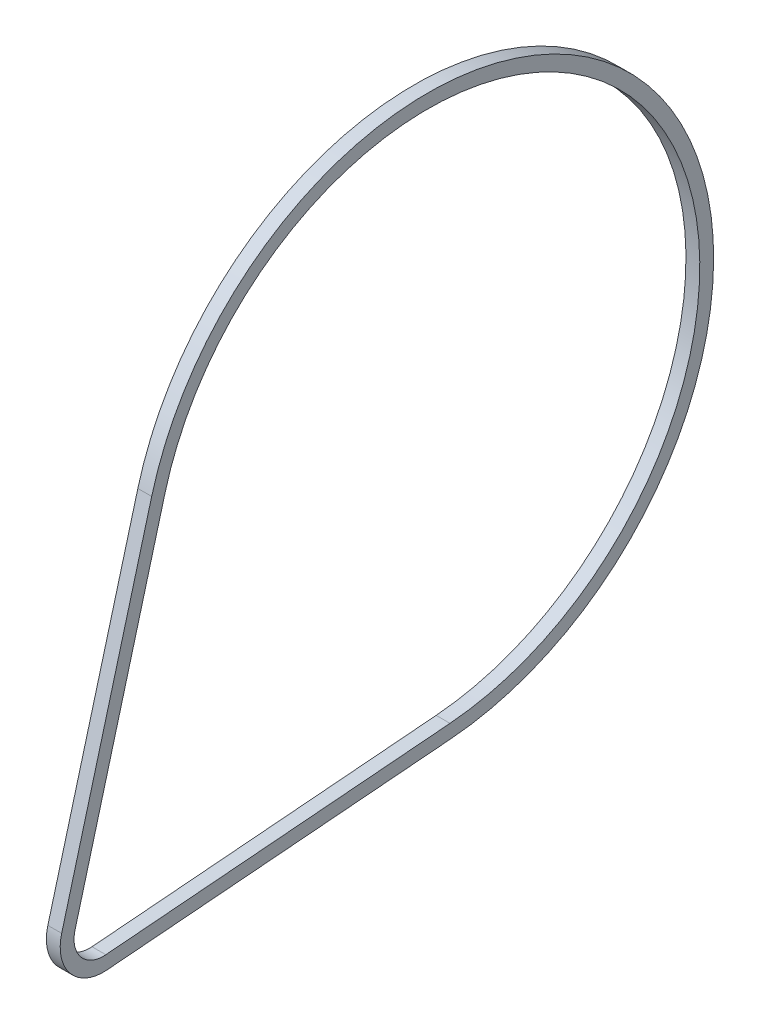
ISO-10303-21;
HEADER;
FILE_DESCRIPTION(('STEP AP214'),'2;1');
FILE_NAME('part.step','',(''),(''),'','','');
FILE_SCHEMA(('AUTOMOTIVE_DESIGN { 1 0 10303 214 1 1 1 1 }'));
ENDSEC;
DATA;
#1=APPLICATION_CONTEXT('core data for automotive mechanical design processes');
#2=APPLICATION_PROTOCOL_DEFINITION('international standard','automotive_design',2000,#1);
#3=PRODUCT_CONTEXT('',#1,'mechanical');
#4=PRODUCT('Part','Part','',(#3));
#5=PRODUCT_RELATED_PRODUCT_CATEGORY('part','',(#4));
#6=PRODUCT_DEFINITION_FORMATION('','',#4);
#7=PRODUCT_DEFINITION_CONTEXT('part definition',#1,'design');
#8=PRODUCT_DEFINITION('design','',#6,#7);
#9=PRODUCT_DEFINITION_SHAPE('','',#8);
#10=(LENGTH_UNIT() NAMED_UNIT(*) SI_UNIT(.MILLI.,.METRE.));
#11=(NAMED_UNIT(*) PLANE_ANGLE_UNIT() SI_UNIT($,.RADIAN.));
#12=(NAMED_UNIT(*) SI_UNIT($,.STERADIAN.) SOLID_ANGLE_UNIT());
#13=UNCERTAINTY_MEASURE_WITH_UNIT(LENGTH_MEASURE(1.E-05),#10,'distance_accuracy_value','');
#14=(GEOMETRIC_REPRESENTATION_CONTEXT(3) GLOBAL_UNCERTAINTY_ASSIGNED_CONTEXT((#13)) GLOBAL_UNIT_ASSIGNED_CONTEXT((#10,
#11,#12)) REPRESENTATION_CONTEXT('',''));
#15=CARTESIAN_POINT('',(0.,0.,0.));
#16=DIRECTION('',(0.,0.,1.));
#17=DIRECTION('',(1.,0.,0.));
#18=AXIS2_PLACEMENT_3D('',#15,#16,#17);
#19=CARTESIAN_POINT('',(5.08,139.776064008969,-221.959303487883));
#20=DIRECTION('',(1.,0.,0.));
#21=DIRECTION('',(0.,0.,-1.));
#22=AXIS2_PLACEMENT_3D('',#19,#20,#21);
#23=PLANE('',#22);
#24=CARTESIAN_POINT('',(5.08,139.776064008969,-221.959303487883));
#25=DIRECTION('',(1.,0.,0.));
#26=DIRECTION('',(0.,0.,-1.));
#27=AXIS2_PLACEMENT_3D('',#24,#25,#26);
#28=CIRCLE('',#27,105.);
#29=CARTESIAN_POINT('',(5.08,35.1288531643463,-230.559376885311));
#30=VERTEX_POINT('',#29);
#31=CARTESIAN_POINT('',(5.08,167.137640487071,-120.586998923802));
#32=VERTEX_POINT('',#31);
#33=EDGE_CURVE('E149',#30,#32,#28,.T.);
#34=ORIENTED_EDGE('',*,*,#33,.T.);
#35=DIRECTION('',(0.,-0.965450519657921,0.260586442648596));
#36=VECTOR('',#35,1.);
#37=CARTESIAN_POINT('',(5.08,167.137640487071,-120.586998923802));
#38=LINE('',#37,#36);
#39=CARTESIAN_POINT('',(5.08,44.700154531778,-87.5396823992513));
#40=VERTEX_POINT('',#39);
#41=EDGE_CURVE('E152',#32,#40,#38,.T.);
#42=ORIENTED_EDGE('',*,*,#41,.T.);
#43=CARTESIAN_POINT('',(5.08,40.5633447546829,-102.866209399001));
#44=DIRECTION('',(1.,0.,0.));
#45=DIRECTION('',(0.,0.,-1.));
#46=AXIS2_PLACEMENT_3D('',#43,#44,#45);
#47=CIRCLE('',#46,15.8750000001865);
#48=CARTESIAN_POINT('',(5.08,24.7416831148934,-104.166458591246));
#49=VERTEX_POINT('',#48);
#50=EDGE_CURVE('E155',#40,#49,#47,.T.);
#51=ORIENTED_EDGE('',*,*,#50,.T.);
#52=DIRECTION('',(0.,0.0819054609278826,-0.996640103282118));
#53=VECTOR('',#52,1.);
#54=CARTESIAN_POINT('',(5.08,24.7416831148934,-104.166458591246));
#55=LINE('',#54,#53);
#56=EDGE_CURVE('E157',#49,#30,#55,.T.);
#57=ORIENTED_EDGE('',*,*,#56,.T.);
#58=EDGE_LOOP('',(#34,#42,#51,#57));
#59=FACE_BOUND('',#58,.T.);
#60=DIRECTION('',(0.,0.0819054609278947,-0.996640103282117));
#61=VECTOR('',#60,1.);
#62=CARTESIAN_POINT('',(5.08,29.8046148395667,-103.750378849733));
#63=LINE('',#62,#61);
#64=CARTESIAN_POINT('',(5.08,29.8046148395667,-103.750378849733));
#65=VERTEX_POINT('',#64);
#66=CARTESIAN_POINT('',(5.08,40.1917848890211,-230.143297143798));
#67=VERTEX_POINT('',#66);
#68=EDGE_CURVE('E121',#65,#67,#63,.T.);
#69=ORIENTED_EDGE('',*,*,#68,.F.);
#70=CARTESIAN_POINT('',(5.08,40.5633447546829,-102.866209399001));
#71=DIRECTION('',(1.,0.,0.));
#72=DIRECTION('',(0.,0.,-1.));
#73=AXIS2_PLACEMENT_3D('',#70,#71,#72);
#74=CIRCLE('',#73,10.7950000001864);
#75=CARTESIAN_POINT('',(5.08,43.3763754031231,-92.4441710391137));
#76=VERTEX_POINT('',#75);
#77=EDGE_CURVE('E113',#76,#65,#74,.T.);
#78=ORIENTED_EDGE('',*,*,#77,.F.);
#79=DIRECTION('',(0.,-0.965450519657921,0.260586442648596));
#80=VECTOR('',#79,1.);
#81=CARTESIAN_POINT('',(5.08,165.813861358417,-125.491487563664));
#82=LINE('',#81,#80);
#83=CARTESIAN_POINT('',(5.08,165.813861358417,-125.491487563665));
#84=VERTEX_POINT('',#83);
#85=EDGE_CURVE('E135',#84,#76,#82,.T.);
#86=ORIENTED_EDGE('',*,*,#85,.F.);
#87=CARTESIAN_POINT('',(5.08,139.776064008969,-221.959303487883));
#88=DIRECTION('',(1.,0.,0.));
#89=DIRECTION('',(0.,0.,-1.));
#90=AXIS2_PLACEMENT_3D('',#87,#88,#89);
#91=CIRCLE('',#90,99.919999999999);
#92=EDGE_CURVE('E133',#67,#84,#91,.T.);
#93=ORIENTED_EDGE('',*,*,#92,.F.);
#94=EDGE_LOOP('',(#69,#78,#86,#93));
#95=FACE_BOUND('',#94,.T.);
#96=ADVANCED_FACE('F48',(#59,#95),#23,.T.);
#97=CARTESIAN_POINT('',(0.,139.776064008969,-221.959303487883));
#98=DIRECTION('',(1.,0.,0.));
#99=DIRECTION('',(0.,0.,-1.));
#100=AXIS2_PLACEMENT_3D('',#97,#98,#99);
#101=PLANE('',#100);
#102=CARTESIAN_POINT('',(0.,139.776064008969,-221.959303487883));
#103=DIRECTION('',(1.,0.,0.));
#104=DIRECTION('',(0.,0.,-1.));
#105=AXIS2_PLACEMENT_3D('',#102,#103,#104);
#106=CIRCLE('',#105,105.);
#107=CARTESIAN_POINT('',(0.,35.1288531643463,-230.559376885311));
#108=VERTEX_POINT('',#107);
#109=CARTESIAN_POINT('',(0.,167.137640487071,-120.586998923802));
#110=VERTEX_POINT('',#109);
#111=EDGE_CURVE('E129',#108,#110,#106,.T.);
#112=ORIENTED_EDGE('',*,*,#111,.F.);
#113=DIRECTION('',(0.,0.0819054609278826,-0.996640103282118));
#114=VECTOR('',#113,1.);
#115=CARTESIAN_POINT('',(0.,24.7416831148934,-104.166458591246));
#116=LINE('',#115,#114);
#117=CARTESIAN_POINT('',(0.,24.7416831148934,-104.166458591246));
#118=VERTEX_POINT('',#117);
#119=EDGE_CURVE('E153',#118,#108,#116,.T.);
#120=ORIENTED_EDGE('',*,*,#119,.F.);
#121=CARTESIAN_POINT('',(0.,40.5633447546829,-102.866209399001));
#122=DIRECTION('',(1.,0.,0.));
#123=DIRECTION('',(0.,0.,-1.));
#124=AXIS2_PLACEMENT_3D('',#121,#122,#123);
#125=CIRCLE('',#124,15.8750000001865);
#126=CARTESIAN_POINT('',(0.,44.700154531778,-87.5396823992513));
#127=VERTEX_POINT('',#126);
#128=EDGE_CURVE('E164',#127,#118,#125,.T.);
#129=ORIENTED_EDGE('',*,*,#128,.F.);
#130=DIRECTION('',(0.,-0.965450519657921,0.260586442648596));
#131=VECTOR('',#130,1.);
#132=CARTESIAN_POINT('',(0.,167.137640487071,-120.586998923802));
#133=LINE('',#132,#131);
#134=EDGE_CURVE('E162',#110,#127,#133,.T.);
#135=ORIENTED_EDGE('',*,*,#134,.F.);
#136=EDGE_LOOP('',(#112,#120,#129,#135));
#137=FACE_BOUND('',#136,.T.);
#138=CARTESIAN_POINT('',(0.,40.5633447546829,-102.866209399001));
#139=DIRECTION('',(1.,0.,0.));
#140=DIRECTION('',(0.,0.,-1.));
#141=AXIS2_PLACEMENT_3D('',#138,#139,#140);
#142=CIRCLE('',#141,10.7950000001864);
#143=CARTESIAN_POINT('',(0.,43.3763754031231,-92.4441710391137));
#144=VERTEX_POINT('',#143);
#145=CARTESIAN_POINT('',(0.,29.8046148395667,-103.750378849733));
#146=VERTEX_POINT('',#145);
#147=EDGE_CURVE('E71',#144,#146,#142,.T.);
#148=ORIENTED_EDGE('',*,*,#147,.T.);
#149=DIRECTION('',(0.,0.0819054609278947,-0.996640103282117));
#150=VECTOR('',#149,1.);
#151=CARTESIAN_POINT('',(0.,29.8046148395667,-103.750378849733));
#152=LINE('',#151,#150);
#153=CARTESIAN_POINT('',(0.,40.1917848890211,-230.143297143798));
#154=VERTEX_POINT('',#153);
#155=EDGE_CURVE('E128',#146,#154,#152,.T.);
#156=ORIENTED_EDGE('',*,*,#155,.T.);
#157=CARTESIAN_POINT('',(0.,139.776064008969,-221.959303487883));
#158=DIRECTION('',(1.,0.,0.));
#159=DIRECTION('',(0.,0.,-1.));
#160=AXIS2_PLACEMENT_3D('',#157,#158,#159);
#161=CIRCLE('',#160,99.919999999999);
#162=CARTESIAN_POINT('',(0.,165.813861358417,-125.491487563665));
#163=VERTEX_POINT('',#162);
#164=EDGE_CURVE('E141',#154,#163,#161,.T.);
#165=ORIENTED_EDGE('',*,*,#164,.T.);
#166=DIRECTION('',(0.,-0.965450519657921,0.260586442648596));
#167=VECTOR('',#166,1.);
#168=CARTESIAN_POINT('',(0.,165.813861358417,-125.491487563664));
#169=LINE('',#168,#167);
#170=EDGE_CURVE('E122',#163,#144,#169,.T.);
#171=ORIENTED_EDGE('',*,*,#170,.T.);
#172=EDGE_LOOP('',(#148,#156,#165,#171));
#173=FACE_BOUND('',#172,.T.);
#174=ADVANCED_FACE('F182',(#137,#173),#101,.F.);
#175=CARTESIAN_POINT('',(5.08,139.776064008969,-221.959303487883));
#176=DIRECTION('',(-1.,0.,0.));
#177=DIRECTION('',(0.,0.,1.));
#178=AXIS2_PLACEMENT_3D('',#175,#176,#177);
#179=CYLINDRICAL_SURFACE('',#178,105.);
#180=ORIENTED_EDGE('',*,*,#111,.T.);
#181=DIRECTION('',(-1.,0.,0.));
#182=VECTOR('',#181,1.);
#183=CARTESIAN_POINT('',(5.08,167.137640487071,-120.586998923802));
#184=LINE('',#183,#182);
#185=EDGE_CURVE('E13',#32,#110,#184,.T.);
#186=ORIENTED_EDGE('',*,*,#185,.F.);
#187=ORIENTED_EDGE('',*,*,#33,.F.);
#188=DIRECTION('',(-1.,0.,0.));
#189=VECTOR('',#188,1.);
#190=CARTESIAN_POINT('',(5.08,35.1288531643463,-230.559376885311));
#191=LINE('',#190,#189);
#192=EDGE_CURVE('E159',#30,#108,#191,.T.);
#193=ORIENTED_EDGE('',*,*,#192,.T.);
#194=EDGE_LOOP('',(#180,#186,#187,#193));
#195=FACE_BOUND('',#194,.T.);
#196=ADVANCED_FACE('F50',(#195),#179,.T.);
#197=CARTESIAN_POINT('',(5.08,167.137640487071,-120.586998923802));
#198=DIRECTION('',(0.,-0.260586442648596,-0.965450519657921));
#199=DIRECTION('',(0.,0.965450519657921,-0.260586442648596));
#200=AXIS2_PLACEMENT_3D('',#197,#198,#199);
#201=PLANE('',#200);
#202=ORIENTED_EDGE('',*,*,#134,.T.);
#203=DIRECTION('',(-1.,0.,0.));
#204=VECTOR('',#203,1.);
#205=CARTESIAN_POINT('',(5.08,44.700154531778,-87.5396823992513));
#206=LINE('',#205,#204);
#207=EDGE_CURVE('E56',#40,#127,#206,.T.);
#208=ORIENTED_EDGE('',*,*,#207,.F.);
#209=ORIENTED_EDGE('',*,*,#41,.F.);
#210=ORIENTED_EDGE('',*,*,#185,.T.);
#211=EDGE_LOOP('',(#202,#208,#209,#210));
#212=FACE_BOUND('',#211,.T.);
#213=ADVANCED_FACE('F192',(#212),#201,.F.);
#214=CARTESIAN_POINT('',(5.08,40.5633447546829,-102.866209399001));
#215=DIRECTION('',(-1.,0.,0.));
#216=DIRECTION('',(0.,0.,1.));
#217=AXIS2_PLACEMENT_3D('',#214,#215,#216);
#218=CYLINDRICAL_SURFACE('',#217,15.8750000001865);
#219=ORIENTED_EDGE('',*,*,#128,.T.);
#220=DIRECTION('',(-1.,0.,0.));
#221=VECTOR('',#220,1.);
#222=CARTESIAN_POINT('',(5.08,24.7416831148934,-104.166458591246));
#223=LINE('',#222,#221);
#224=EDGE_CURVE('E169',#49,#118,#223,.T.);
#225=ORIENTED_EDGE('',*,*,#224,.F.);
#226=ORIENTED_EDGE('',*,*,#50,.F.);
#227=ORIENTED_EDGE('',*,*,#207,.T.);
#228=EDGE_LOOP('',(#219,#225,#226,#227));
#229=FACE_BOUND('',#228,.T.);
#230=ADVANCED_FACE('F176',(#229),#218,.T.);
#231=CARTESIAN_POINT('',(5.08,24.7416831148934,-104.166458591246));
#232=DIRECTION('',(0.,0.996640103282118,0.0819054609278826));
#233=DIRECTION('',(0.,-0.0819054609278826,0.996640103282118));
#234=AXIS2_PLACEMENT_3D('',#231,#232,#233);
#235=PLANE('',#234);
#236=ORIENTED_EDGE('',*,*,#119,.T.);
#237=ORIENTED_EDGE('',*,*,#192,.F.);
#238=ORIENTED_EDGE('',*,*,#56,.F.);
#239=ORIENTED_EDGE('',*,*,#224,.T.);
#240=EDGE_LOOP('',(#236,#237,#238,#239));
#241=FACE_BOUND('',#240,.T.);
#242=ADVANCED_FACE('F186',(#241),#235,.F.);
#243=CARTESIAN_POINT('',(5.08,40.5633447546829,-102.866209399001));
#244=DIRECTION('',(-1.,0.,0.));
#245=DIRECTION('',(0.,0.,1.));
#246=AXIS2_PLACEMENT_3D('',#243,#244,#245);
#247=CYLINDRICAL_SURFACE('',#246,10.7950000001864);
#248=ORIENTED_EDGE('',*,*,#147,.F.);
#249=DIRECTION('',(-1.,0.,0.));
#250=VECTOR('',#249,1.);
#251=CARTESIAN_POINT('',(5.08,43.3763754031231,-92.4441710391137));
#252=LINE('',#251,#250);
#253=EDGE_CURVE('E117',#76,#144,#252,.T.);
#254=ORIENTED_EDGE('',*,*,#253,.F.);
#255=ORIENTED_EDGE('',*,*,#77,.T.);
#256=DIRECTION('',(-1.,0.,0.));
#257=VECTOR('',#256,1.);
#258=CARTESIAN_POINT('',(5.08,29.8046148395667,-103.750378849733));
#259=LINE('',#258,#257);
#260=EDGE_CURVE('E116',#65,#146,#259,.T.);
#261=ORIENTED_EDGE('',*,*,#260,.T.);
#262=EDGE_LOOP('',(#248,#254,#255,#261));
#263=FACE_BOUND('',#262,.T.);
#264=ADVANCED_FACE('F115',(#263),#247,.F.);
#265=CARTESIAN_POINT('',(5.08,29.8046148395667,-103.750378849733));
#266=DIRECTION('',(0.,0.996640103282117,0.0819054609278947));
#267=DIRECTION('',(0.,-0.0819054609278947,0.996640103282117));
#268=AXIS2_PLACEMENT_3D('',#265,#266,#267);
#269=PLANE('',#268);
#270=ORIENTED_EDGE('',*,*,#155,.F.);
#271=ORIENTED_EDGE('',*,*,#260,.F.);
#272=ORIENTED_EDGE('',*,*,#68,.T.);
#273=DIRECTION('',(-1.,0.,0.));
#274=VECTOR('',#273,1.);
#275=CARTESIAN_POINT('',(5.08,40.1917848890211,-230.143297143798));
#276=LINE('',#275,#274);
#277=EDGE_CURVE('E130',#67,#154,#276,.T.);
#278=ORIENTED_EDGE('',*,*,#277,.T.);
#279=EDGE_LOOP('',(#270,#271,#272,#278));
#280=FACE_BOUND('',#279,.T.);
#281=ADVANCED_FACE('F125',(#280),#269,.T.);
#282=CARTESIAN_POINT('',(5.08,139.776064008969,-221.959303487883));
#283=DIRECTION('',(-1.,0.,0.));
#284=DIRECTION('',(0.,0.,1.));
#285=AXIS2_PLACEMENT_3D('',#282,#283,#284);
#286=CYLINDRICAL_SURFACE('',#285,99.919999999999);
#287=ORIENTED_EDGE('',*,*,#164,.F.);
#288=ORIENTED_EDGE('',*,*,#277,.F.);
#289=ORIENTED_EDGE('',*,*,#92,.T.);
#290=DIRECTION('',(-1.,0.,0.));
#291=VECTOR('',#290,1.);
#292=CARTESIAN_POINT('',(5.08,165.813861358417,-125.491487563665));
#293=LINE('',#292,#291);
#294=EDGE_CURVE('E63',#84,#163,#293,.T.);
#295=ORIENTED_EDGE('',*,*,#294,.T.);
#296=EDGE_LOOP('',(#287,#288,#289,#295));
#297=FACE_BOUND('',#296,.T.);
#298=ADVANCED_FACE('F215',(#297),#286,.F.);
#299=CARTESIAN_POINT('',(5.08,165.813861358417,-125.491487563664));
#300=DIRECTION('',(0.,-0.260586442648596,-0.965450519657921));
#301=DIRECTION('',(0.,0.965450519657921,-0.260586442648596));
#302=AXIS2_PLACEMENT_3D('',#299,#300,#301);
#303=PLANE('',#302);
#304=ORIENTED_EDGE('',*,*,#170,.F.);
#305=ORIENTED_EDGE('',*,*,#294,.F.);
#306=ORIENTED_EDGE('',*,*,#85,.T.);
#307=ORIENTED_EDGE('',*,*,#253,.T.);
#308=EDGE_LOOP('',(#304,#305,#306,#307));
#309=FACE_BOUND('',#308,.T.);
#310=ADVANCED_FACE('F219',(#309),#303,.T.);
#311=CLOSED_SHELL('',(#96,#174,#196,#213,#230,#242,#264,#281,#298,#310));
#312=MANIFOLD_SOLID_BREP('B2',#311);
#313=ADVANCED_BREP_SHAPE_REPRESENTATION('',(#18,#312),#14);
#314=SHAPE_DEFINITION_REPRESENTATION(#9,#313);
ENDSEC;
END-ISO-10303-21;
